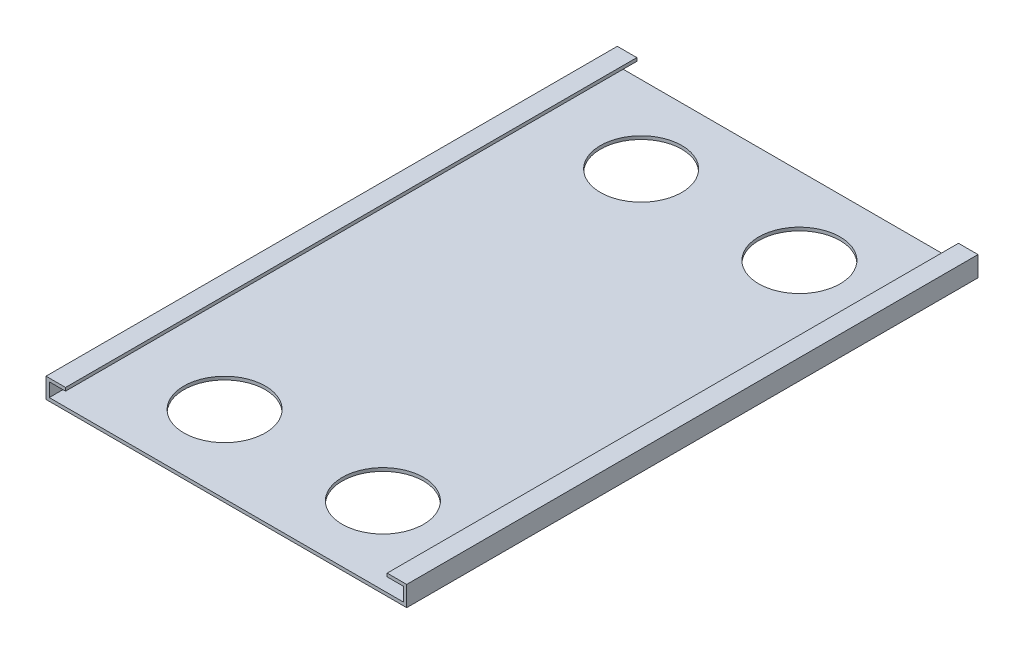
ISO-10303-21;
HEADER;
FILE_DESCRIPTION(('STEP AP214'),'2;1');
FILE_NAME('part.step','',(''),(''),'','','');
FILE_SCHEMA(('AUTOMOTIVE_DESIGN { 1 0 10303 214 1 1 1 1 }'));
ENDSEC;
DATA;
#1=APPLICATION_CONTEXT('core data for automotive mechanical design processes');
#2=APPLICATION_PROTOCOL_DEFINITION('international standard','automotive_design',2000,#1);
#3=PRODUCT_CONTEXT('',#1,'mechanical');
#4=PRODUCT('Part','Part','',(#3));
#5=PRODUCT_RELATED_PRODUCT_CATEGORY('part','',(#4));
#6=PRODUCT_DEFINITION_FORMATION('','',#4);
#7=PRODUCT_DEFINITION_CONTEXT('part definition',#1,'design');
#8=PRODUCT_DEFINITION('design','',#6,#7);
#9=PRODUCT_DEFINITION_SHAPE('','',#8);
#10=(LENGTH_UNIT() NAMED_UNIT(*) SI_UNIT(.MILLI.,.METRE.));
#11=(NAMED_UNIT(*) PLANE_ANGLE_UNIT() SI_UNIT($,.RADIAN.));
#12=(NAMED_UNIT(*) SI_UNIT($,.STERADIAN.) SOLID_ANGLE_UNIT());
#13=UNCERTAINTY_MEASURE_WITH_UNIT(LENGTH_MEASURE(1.E-05),#10,'distance_accuracy_value','');
#14=(GEOMETRIC_REPRESENTATION_CONTEXT(3) GLOBAL_UNCERTAINTY_ASSIGNED_CONTEXT((#13)) GLOBAL_UNIT_ASSIGNED_CONTEXT((#10,
#11,#12)) REPRESENTATION_CONTEXT('',''));
#15=CARTESIAN_POINT('',(0.,0.,0.));
#16=DIRECTION('',(0.,0.,1.));
#17=DIRECTION('',(1.,0.,0.));
#18=AXIS2_PLACEMENT_3D('',#15,#16,#17);
#19=CARTESIAN_POINT('',(-27.6352,2.13359999999999,89.154));
#20=DIRECTION('',(0.,1.,0.));
#21=DIRECTION('',(0.,0.,1.));
#22=AXIS2_PLACEMENT_3D('',#19,#20,#21);
#23=PLANE('',#22);
#24=DIRECTION('',(1.,0.,0.));
#25=VECTOR('',#24,1.);
#26=CARTESIAN_POINT('',(-27.6352,2.13359999999999,0.));
#27=LINE('',#26,#25);
#28=CARTESIAN_POINT('',(-27.6352,2.13359999999999,0.));
#29=VERTEX_POINT('',#28);
#30=CARTESIAN_POINT('',(-25.0952,2.13359999999999,0.));
#31=VERTEX_POINT('',#30);
#32=EDGE_CURVE('E155',#29,#31,#27,.T.);
#33=ORIENTED_EDGE('',*,*,#32,.T.);
#34=DIRECTION('',(0.,0.,-1.));
#35=VECTOR('',#34,1.);
#36=CARTESIAN_POINT('',(-25.0952,2.13359999999999,89.154));
#37=LINE('',#36,#35);
#38=CARTESIAN_POINT('',(-25.0952,2.13359999999999,89.154));
#39=VERTEX_POINT('',#38);
#40=EDGE_CURVE('E11',#39,#31,#37,.T.);
#41=ORIENTED_EDGE('',*,*,#40,.F.);
#42=DIRECTION('',(1.,0.,0.));
#43=VECTOR('',#42,1.);
#44=CARTESIAN_POINT('',(-27.6352,2.13359999999999,89.154));
#45=LINE('',#44,#43);
#46=CARTESIAN_POINT('',(-27.6352,2.13359999999999,89.154));
#47=VERTEX_POINT('',#46);
#48=EDGE_CURVE('E103',#47,#39,#45,.T.);
#49=ORIENTED_EDGE('',*,*,#48,.F.);
#50=DIRECTION('',(0.,0.,-1.));
#51=VECTOR('',#50,1.);
#52=CARTESIAN_POINT('',(-27.6352,2.13359999999999,89.154));
#53=LINE('',#52,#51);
#54=EDGE_CURVE('E151',#47,#29,#53,.T.);
#55=ORIENTED_EDGE('',*,*,#54,.T.);
#56=EDGE_LOOP('',(#33,#41,#49,#55));
#57=FACE_BOUND('',#56,.T.);
#58=ADVANCED_FACE('F33',(#57),#23,.F.);
#59=CARTESIAN_POINT('',(-25.0952,2.64159999999999,89.154));
#60=DIRECTION('',(1.,0.,0.));
#61=DIRECTION('',(0.,0.,-1.));
#62=AXIS2_PLACEMENT_3D('',#59,#60,#61);
#63=PLANE('',#62);
#64=DIRECTION('',(0.,-1.,0.));
#65=VECTOR('',#64,1.);
#66=CARTESIAN_POINT('',(-25.0952,2.64159999999999,0.));
#67=LINE('',#66,#65);
#68=CARTESIAN_POINT('',(-25.0952,2.64159999999999,0.));
#69=VERTEX_POINT('',#68);
#70=EDGE_CURVE('E158',#69,#31,#67,.T.);
#71=ORIENTED_EDGE('',*,*,#70,.F.);
#72=DIRECTION('',(0.,0.,-1.));
#73=VECTOR('',#72,1.);
#74=CARTESIAN_POINT('',(-25.0952,2.64159999999999,89.154));
#75=LINE('',#74,#73);
#76=CARTESIAN_POINT('',(-25.0952,2.64159999999999,89.154));
#77=VERTEX_POINT('',#76);
#78=EDGE_CURVE('E42',#77,#69,#75,.T.);
#79=ORIENTED_EDGE('',*,*,#78,.F.);
#80=DIRECTION('',(0.,-1.,0.));
#81=VECTOR('',#80,1.);
#82=CARTESIAN_POINT('',(-25.0952,2.64159999999999,89.154));
#83=LINE('',#82,#81);
#84=EDGE_CURVE('E224',#77,#39,#83,.T.);
#85=ORIENTED_EDGE('',*,*,#84,.T.);
#86=ORIENTED_EDGE('',*,*,#40,.T.);
#87=EDGE_LOOP('',(#71,#79,#85,#86));
#88=FACE_BOUND('',#87,.T.);
#89=ADVANCED_FACE('F269',(#88),#63,.T.);
#90=CARTESIAN_POINT('',(-27.6352,2.64159999999999,89.154));
#91=DIRECTION('',(0.,1.,0.));
#92=DIRECTION('',(0.,0.,1.));
#93=AXIS2_PLACEMENT_3D('',#90,#91,#92);
#94=PLANE('',#93);
#95=DIRECTION('',(1.,0.,0.));
#96=VECTOR('',#95,1.);
#97=CARTESIAN_POINT('',(-27.6352,2.64159999999999,0.));
#98=LINE('',#97,#96);
#99=CARTESIAN_POINT('',(-28.1432,2.64159999999999,0.));
#100=VERTEX_POINT('',#99);
#101=EDGE_CURVE('E162',#100,#69,#98,.T.);
#102=ORIENTED_EDGE('',*,*,#101,.F.);
#103=DIRECTION('',(0.,0.,-1.));
#104=VECTOR('',#103,1.);
#105=CARTESIAN_POINT('',(-28.1432,2.64159999999999,89.154));
#106=LINE('',#105,#104);
#107=CARTESIAN_POINT('',(-28.1432,2.64159999999999,89.154));
#108=VERTEX_POINT('',#107);
#109=EDGE_CURVE('E198',#108,#100,#106,.T.);
#110=ORIENTED_EDGE('',*,*,#109,.F.);
#111=DIRECTION('',(1.,0.,0.));
#112=VECTOR('',#111,1.);
#113=CARTESIAN_POINT('',(-27.6352,2.64159999999999,89.154));
#114=LINE('',#113,#112);
#115=EDGE_CURVE('E227',#108,#77,#114,.T.);
#116=ORIENTED_EDGE('',*,*,#115,.T.);
#117=ORIENTED_EDGE('',*,*,#78,.T.);
#118=EDGE_LOOP('',(#102,#110,#116,#117));
#119=FACE_BOUND('',#118,.T.);
#120=ADVANCED_FACE('F274',(#119),#94,.T.);
#121=CARTESIAN_POINT('',(-28.1432,0.,89.154));
#122=DIRECTION('',(-1.,0.,0.));
#123=DIRECTION('',(0.,0.,1.));
#124=AXIS2_PLACEMENT_3D('',#121,#122,#123);
#125=PLANE('',#124);
#126=DIRECTION('',(0.,1.,0.));
#127=VECTOR('',#126,1.);
#128=CARTESIAN_POINT('',(-28.1432,0.,0.));
#129=LINE('',#128,#127);
#130=CARTESIAN_POINT('',(-28.1432,-0.508,0.));
#131=VERTEX_POINT('',#130);
#132=EDGE_CURVE('E165',#131,#100,#129,.T.);
#133=ORIENTED_EDGE('',*,*,#132,.F.);
#134=DIRECTION('',(0.,0.,-1.));
#135=VECTOR('',#134,1.);
#136=CARTESIAN_POINT('',(-28.1432,-0.508,89.154));
#137=LINE('',#136,#135);
#138=CARTESIAN_POINT('',(-28.1432,-0.508,89.154));
#139=VERTEX_POINT('',#138);
#140=EDGE_CURVE('E196',#139,#131,#137,.T.);
#141=ORIENTED_EDGE('',*,*,#140,.F.);
#142=DIRECTION('',(0.,1.,0.));
#143=VECTOR('',#142,1.);
#144=CARTESIAN_POINT('',(-28.1432,0.,89.154));
#145=LINE('',#144,#143);
#146=EDGE_CURVE('E230',#139,#108,#145,.T.);
#147=ORIENTED_EDGE('',*,*,#146,.T.);
#148=ORIENTED_EDGE('',*,*,#109,.T.);
#149=EDGE_LOOP('',(#133,#141,#147,#148));
#150=FACE_BOUND('',#149,.T.);
#151=ADVANCED_FACE('F283',(#150),#125,.T.);
#152=CARTESIAN_POINT('',(27.6352,-0.508,89.154));
#153=DIRECTION('',(0.,-1.,0.));
#154=DIRECTION('',(0.,0.,-1.));
#155=AXIS2_PLACEMENT_3D('',#152,#153,#154);
#156=PLANE('',#155);
#157=CARTESIAN_POINT('',(12.35,-0.508,12.077));
#158=DIRECTION('',(0.,-1.,0.));
#159=DIRECTION('',(0.,0.,-1.));
#160=AXIS2_PLACEMENT_3D('',#157,#158,#159);
#161=CIRCLE('',#160,6.35);
#162=CARTESIAN_POINT('',(12.35,-0.508,5.727));
#163=VERTEX_POINT('',#162);
#164=EDGE_CURVE('E159',#163,#163,#161,.T.);
#165=ORIENTED_EDGE('',*,*,#164,.F.);
#166=EDGE_LOOP('',(#165));
#167=FACE_BOUND('',#166,.T.);
#168=CARTESIAN_POINT('',(-12.35,-0.508,12.077));
#169=DIRECTION('',(0.,-1.,0.));
#170=DIRECTION('',(0.,0.,-1.));
#171=AXIS2_PLACEMENT_3D('',#168,#169,#170);
#172=CIRCLE('',#171,6.35);
#173=CARTESIAN_POINT('',(-12.35,-0.508,5.727));
#174=VERTEX_POINT('',#173);
#175=EDGE_CURVE('E210',#174,#174,#172,.T.);
#176=ORIENTED_EDGE('',*,*,#175,.F.);
#177=EDGE_LOOP('',(#176));
#178=FACE_BOUND('',#177,.T.);
#179=CARTESIAN_POINT('',(-12.35,-0.508,77.077));
#180=DIRECTION('',(0.,-1.,0.));
#181=DIRECTION('',(0.,0.,-1.));
#182=AXIS2_PLACEMENT_3D('',#179,#180,#181);
#183=CIRCLE('',#182,6.35);
#184=CARTESIAN_POINT('',(-12.35,-0.508,70.727));
#185=VERTEX_POINT('',#184);
#186=EDGE_CURVE('E207',#185,#185,#183,.T.);
#187=ORIENTED_EDGE('',*,*,#186,.F.);
#188=EDGE_LOOP('',(#187));
#189=FACE_BOUND('',#188,.T.);
#190=CARTESIAN_POINT('',(12.35,-0.508,77.077));
#191=DIRECTION('',(0.,-1.,0.));
#192=DIRECTION('',(0.,0.,-1.));
#193=AXIS2_PLACEMENT_3D('',#190,#191,#192);
#194=CIRCLE('',#193,6.35);
#195=CARTESIAN_POINT('',(12.35,-0.508,70.727));
#196=VERTEX_POINT('',#195);
#197=EDGE_CURVE('E204',#196,#196,#194,.T.);
#198=ORIENTED_EDGE('',*,*,#197,.F.);
#199=EDGE_LOOP('',(#198));
#200=FACE_BOUND('',#199,.T.);
#201=DIRECTION('',(1.,0.,0.));
#202=VECTOR('',#201,1.);
#203=CARTESIAN_POINT('',(27.6352,-0.508,0.));
#204=LINE('',#203,#202);
#205=CARTESIAN_POINT('',(28.1432,-0.508,0.));
#206=VERTEX_POINT('',#205);
#207=EDGE_CURVE('E168',#206,#131,#204,.F.);
#208=ORIENTED_EDGE('',*,*,#207,.F.);
#209=DIRECTION('',(0.,0.,-1.));
#210=VECTOR('',#209,1.);
#211=CARTESIAN_POINT('',(28.1432,-0.508,89.154));
#212=LINE('',#211,#210);
#213=CARTESIAN_POINT('',(28.1432,-0.508,89.154));
#214=VERTEX_POINT('',#213);
#215=EDGE_CURVE('E194',#214,#206,#212,.T.);
#216=ORIENTED_EDGE('',*,*,#215,.F.);
#217=DIRECTION('',(1.,0.,0.));
#218=VECTOR('',#217,1.);
#219=CARTESIAN_POINT('',(27.6352,-0.508,89.154));
#220=LINE('',#219,#218);
#221=EDGE_CURVE('E233',#214,#139,#220,.F.);
#222=ORIENTED_EDGE('',*,*,#221,.T.);
#223=ORIENTED_EDGE('',*,*,#140,.T.);
#224=EDGE_LOOP('',(#208,#216,#222,#223));
#225=FACE_BOUND('',#224,.T.);
#226=ADVANCED_FACE('F286',(#167,#178,#189,#200,#225),#156,.T.);
#227=CARTESIAN_POINT('',(28.1432,0.,89.154));
#228=DIRECTION('',(1.,0.,0.));
#229=DIRECTION('',(0.,0.,-1.));
#230=AXIS2_PLACEMENT_3D('',#227,#228,#229);
#231=PLANE('',#230);
#232=DIRECTION('',(0.,1.,0.));
#233=VECTOR('',#232,1.);
#234=CARTESIAN_POINT('',(28.1432,0.,0.));
#235=LINE('',#234,#233);
#236=CARTESIAN_POINT('',(28.1432,2.64159999999999,0.));
#237=VERTEX_POINT('',#236);
#238=EDGE_CURVE('E171',#237,#206,#235,.F.);
#239=ORIENTED_EDGE('',*,*,#238,.F.);
#240=DIRECTION('',(0.,0.,-1.));
#241=VECTOR('',#240,1.);
#242=CARTESIAN_POINT('',(28.1432,2.64159999999999,89.154));
#243=LINE('',#242,#241);
#244=CARTESIAN_POINT('',(28.1432,2.64159999999999,89.154));
#245=VERTEX_POINT('',#244);
#246=EDGE_CURVE('E192',#245,#237,#243,.T.);
#247=ORIENTED_EDGE('',*,*,#246,.F.);
#248=DIRECTION('',(0.,1.,0.));
#249=VECTOR('',#248,1.);
#250=CARTESIAN_POINT('',(28.1432,0.,89.154));
#251=LINE('',#250,#249);
#252=EDGE_CURVE('E236',#245,#214,#251,.F.);
#253=ORIENTED_EDGE('',*,*,#252,.T.);
#254=ORIENTED_EDGE('',*,*,#215,.T.);
#255=EDGE_LOOP('',(#239,#247,#253,#254));
#256=FACE_BOUND('',#255,.T.);
#257=ADVANCED_FACE('F288',(#256),#231,.T.);
#258=CARTESIAN_POINT('',(27.6352,2.64159999999999,89.154));
#259=DIRECTION('',(0.,1.,0.));
#260=DIRECTION('',(0.,0.,1.));
#261=AXIS2_PLACEMENT_3D('',#258,#259,#260);
#262=PLANE('',#261);
#263=DIRECTION('',(1.,0.,0.));
#264=VECTOR('',#263,1.);
#265=CARTESIAN_POINT('',(27.6352,2.64159999999999,0.));
#266=LINE('',#265,#264);
#267=CARTESIAN_POINT('',(25.0952,2.64159999999999,0.));
#268=VERTEX_POINT('',#267);
#269=EDGE_CURVE('E174',#268,#237,#266,.T.);
#270=ORIENTED_EDGE('',*,*,#269,.F.);
#271=DIRECTION('',(0.,0.,-1.));
#272=VECTOR('',#271,1.);
#273=CARTESIAN_POINT('',(25.0952,2.64159999999999,89.154));
#274=LINE('',#273,#272);
#275=CARTESIAN_POINT('',(25.0952,2.64159999999999,89.154));
#276=VERTEX_POINT('',#275);
#277=EDGE_CURVE('E190',#276,#268,#274,.T.);
#278=ORIENTED_EDGE('',*,*,#277,.F.);
#279=DIRECTION('',(1.,0.,0.));
#280=VECTOR('',#279,1.);
#281=CARTESIAN_POINT('',(27.6352,2.64159999999999,89.154));
#282=LINE('',#281,#280);
#283=EDGE_CURVE('E239',#276,#245,#282,.T.);
#284=ORIENTED_EDGE('',*,*,#283,.T.);
#285=ORIENTED_EDGE('',*,*,#246,.T.);
#286=EDGE_LOOP('',(#270,#278,#284,#285));
#287=FACE_BOUND('',#286,.T.);
#288=ADVANCED_FACE('F252',(#287),#262,.T.);
#289=CARTESIAN_POINT('',(25.0952,2.13359999999999,89.154));
#290=DIRECTION('',(-1.,0.,0.));
#291=DIRECTION('',(0.,0.,1.));
#292=AXIS2_PLACEMENT_3D('',#289,#290,#291);
#293=PLANE('',#292);
#294=DIRECTION('',(0.,1.,0.));
#295=VECTOR('',#294,1.);
#296=CARTESIAN_POINT('',(25.0952,2.13359999999999,0.));
#297=LINE('',#296,#295);
#298=CARTESIAN_POINT('',(25.0952,2.13359999999999,0.));
#299=VERTEX_POINT('',#298);
#300=EDGE_CURVE('E177',#299,#268,#297,.T.);
#301=ORIENTED_EDGE('',*,*,#300,.F.);
#302=DIRECTION('',(0.,0.,-1.));
#303=VECTOR('',#302,1.);
#304=CARTESIAN_POINT('',(25.0952,2.13359999999999,89.154));
#305=LINE('',#304,#303);
#306=CARTESIAN_POINT('',(25.0952,2.13359999999999,89.154));
#307=VERTEX_POINT('',#306);
#308=EDGE_CURVE('E188',#307,#299,#305,.T.);
#309=ORIENTED_EDGE('',*,*,#308,.F.);
#310=DIRECTION('',(0.,1.,0.));
#311=VECTOR('',#310,1.);
#312=CARTESIAN_POINT('',(25.0952,2.13359999999999,89.154));
#313=LINE('',#312,#311);
#314=EDGE_CURVE('E242',#307,#276,#313,.T.);
#315=ORIENTED_EDGE('',*,*,#314,.T.);
#316=ORIENTED_EDGE('',*,*,#277,.T.);
#317=EDGE_LOOP('',(#301,#309,#315,#316));
#318=FACE_BOUND('',#317,.T.);
#319=ADVANCED_FACE('F246',(#318),#293,.T.);
#320=CARTESIAN_POINT('',(27.6352,2.13359999999999,89.154));
#321=DIRECTION('',(0.,1.,0.));
#322=DIRECTION('',(0.,0.,1.));
#323=AXIS2_PLACEMENT_3D('',#320,#321,#322);
#324=PLANE('',#323);
#325=DIRECTION('',(1.,0.,0.));
#326=VECTOR('',#325,1.);
#327=CARTESIAN_POINT('',(27.6352,2.13359999999999,0.));
#328=LINE('',#327,#326);
#329=CARTESIAN_POINT('',(27.6352,2.13359999999999,0.));
#330=VERTEX_POINT('',#329);
#331=EDGE_CURVE('E180',#299,#330,#328,.T.);
#332=ORIENTED_EDGE('',*,*,#331,.T.);
#333=DIRECTION('',(0.,0.,-1.));
#334=VECTOR('',#333,1.);
#335=CARTESIAN_POINT('',(27.6352,2.13359999999999,89.154));
#336=LINE('',#335,#334);
#337=CARTESIAN_POINT('',(27.6352,2.13359999999999,89.154));
#338=VERTEX_POINT('',#337);
#339=EDGE_CURVE('E146',#338,#330,#336,.T.);
#340=ORIENTED_EDGE('',*,*,#339,.F.);
#341=DIRECTION('',(1.,0.,0.));
#342=VECTOR('',#341,1.);
#343=CARTESIAN_POINT('',(27.6352,2.13359999999999,89.154));
#344=LINE('',#343,#342);
#345=EDGE_CURVE('E137',#307,#338,#344,.T.);
#346=ORIENTED_EDGE('',*,*,#345,.F.);
#347=ORIENTED_EDGE('',*,*,#308,.T.);
#348=EDGE_LOOP('',(#332,#340,#346,#347));
#349=FACE_BOUND('',#348,.T.);
#350=ADVANCED_FACE('F259',(#349),#324,.F.);
#351=CARTESIAN_POINT('',(27.6352,0.,89.154));
#352=DIRECTION('',(1.,0.,0.));
#353=DIRECTION('',(0.,0.,-1.));
#354=AXIS2_PLACEMENT_3D('',#351,#352,#353);
#355=PLANE('',#354);
#356=DIRECTION('',(0.,-1.,0.));
#357=VECTOR('',#356,1.);
#358=CARTESIAN_POINT('',(27.6352,0.,0.));
#359=LINE('',#358,#357);
#360=CARTESIAN_POINT('',(27.6352,0.,0.));
#361=VERTEX_POINT('',#360);
#362=EDGE_CURVE('E145',#330,#361,#359,.T.);
#363=ORIENTED_EDGE('',*,*,#362,.T.);
#364=DIRECTION('',(0.,0.,-1.));
#365=VECTOR('',#364,1.);
#366=CARTESIAN_POINT('',(27.6352,0.,89.154));
#367=LINE('',#366,#365);
#368=CARTESIAN_POINT('',(27.6352,0.,89.154));
#369=VERTEX_POINT('',#368);
#370=EDGE_CURVE('E142',#369,#361,#367,.T.);
#371=ORIENTED_EDGE('',*,*,#370,.F.);
#372=DIRECTION('',(0.,-1.,0.));
#373=VECTOR('',#372,1.);
#374=CARTESIAN_POINT('',(27.6352,0.,89.154));
#375=LINE('',#374,#373);
#376=EDGE_CURVE('E130',#338,#369,#375,.T.);
#377=ORIENTED_EDGE('',*,*,#376,.F.);
#378=ORIENTED_EDGE('',*,*,#339,.T.);
#379=EDGE_LOOP('',(#363,#371,#377,#378));
#380=FACE_BOUND('',#379,.T.);
#381=ADVANCED_FACE('F143',(#380),#355,.F.);
#382=CARTESIAN_POINT('',(27.6352,0.,89.154));
#383=DIRECTION('',(0.,-1.,0.));
#384=DIRECTION('',(0.,0.,-1.));
#385=AXIS2_PLACEMENT_3D('',#382,#383,#384);
#386=PLANE('',#385);
#387=CARTESIAN_POINT('',(12.35,0.,12.077));
#388=DIRECTION('',(0.,-1.,0.));
#389=DIRECTION('',(0.,0.,-1.));
#390=AXIS2_PLACEMENT_3D('',#387,#388,#389);
#391=CIRCLE('',#390,6.35);
#392=CARTESIAN_POINT('',(12.35,0.,5.727));
#393=VERTEX_POINT('',#392);
#394=EDGE_CURVE('E36',#393,#393,#391,.T.);
#395=ORIENTED_EDGE('',*,*,#394,.T.);
#396=EDGE_LOOP('',(#395));
#397=FACE_BOUND('',#396,.T.);
#398=CARTESIAN_POINT('',(-12.35,0.,12.077));
#399=DIRECTION('',(0.,-1.,0.));
#400=DIRECTION('',(0.,0.,-1.));
#401=AXIS2_PLACEMENT_3D('',#398,#399,#400);
#402=CIRCLE('',#401,6.35);
#403=CARTESIAN_POINT('',(-12.35,0.,5.727));
#404=VERTEX_POINT('',#403);
#405=EDGE_CURVE('E208',#404,#404,#402,.T.);
#406=ORIENTED_EDGE('',*,*,#405,.T.);
#407=EDGE_LOOP('',(#406));
#408=FACE_BOUND('',#407,.T.);
#409=CARTESIAN_POINT('',(-12.35,0.,77.077));
#410=DIRECTION('',(0.,-1.,0.));
#411=DIRECTION('',(0.,0.,-1.));
#412=AXIS2_PLACEMENT_3D('',#409,#410,#411);
#413=CIRCLE('',#412,6.35);
#414=CARTESIAN_POINT('',(-12.35,0.,70.727));
#415=VERTEX_POINT('',#414);
#416=EDGE_CURVE('E205',#415,#415,#413,.T.);
#417=ORIENTED_EDGE('',*,*,#416,.T.);
#418=EDGE_LOOP('',(#417));
#419=FACE_BOUND('',#418,.T.);
#420=CARTESIAN_POINT('',(12.35,0.,77.077));
#421=DIRECTION('',(0.,-1.,0.));
#422=DIRECTION('',(0.,0.,-1.));
#423=AXIS2_PLACEMENT_3D('',#420,#421,#422);
#424=CIRCLE('',#423,6.35);
#425=CARTESIAN_POINT('',(12.35,0.,70.727));
#426=VERTEX_POINT('',#425);
#427=EDGE_CURVE('E201',#426,#426,#424,.T.);
#428=ORIENTED_EDGE('',*,*,#427,.T.);
#429=EDGE_LOOP('',(#428));
#430=FACE_BOUND('',#429,.T.);
#431=DIRECTION('',(-1.,0.,0.));
#432=VECTOR('',#431,1.);
#433=CARTESIAN_POINT('',(27.6352,0.,0.));
#434=LINE('',#433,#432);
#435=CARTESIAN_POINT('',(-27.6352,0.,0.));
#436=VERTEX_POINT('',#435);
#437=EDGE_CURVE('E91',#361,#436,#434,.T.);
#438=ORIENTED_EDGE('',*,*,#437,.T.);
#439=DIRECTION('',(0.,0.,-1.));
#440=VECTOR('',#439,1.);
#441=CARTESIAN_POINT('',(-27.6352,0.,89.154));
#442=LINE('',#441,#440);
#443=CARTESIAN_POINT('',(-27.6352,0.,89.154));
#444=VERTEX_POINT('',#443);
#445=EDGE_CURVE('E147',#444,#436,#442,.T.);
#446=ORIENTED_EDGE('',*,*,#445,.F.);
#447=DIRECTION('',(-1.,0.,0.));
#448=VECTOR('',#447,1.);
#449=CARTESIAN_POINT('',(27.6352,0.,89.154));
#450=LINE('',#449,#448);
#451=EDGE_CURVE('E134',#369,#444,#450,.T.);
#452=ORIENTED_EDGE('',*,*,#451,.F.);
#453=ORIENTED_EDGE('',*,*,#370,.T.);
#454=EDGE_LOOP('',(#438,#446,#452,#453));
#455=FACE_BOUND('',#454,.T.);
#456=ADVANCED_FACE('F149',(#397,#408,#419,#430,#455),#386,.F.);
#457=CARTESIAN_POINT('',(-27.6352,0.,89.154));
#458=DIRECTION('',(-1.,0.,0.));
#459=DIRECTION('',(0.,0.,1.));
#460=AXIS2_PLACEMENT_3D('',#457,#458,#459);
#461=PLANE('',#460);
#462=DIRECTION('',(0.,1.,0.));
#463=VECTOR('',#462,1.);
#464=CARTESIAN_POINT('',(-27.6352,0.,0.));
#465=LINE('',#464,#463);
#466=EDGE_CURVE('E97',#436,#29,#465,.T.);
#467=ORIENTED_EDGE('',*,*,#466,.T.);
#468=ORIENTED_EDGE('',*,*,#54,.F.);
#469=DIRECTION('',(0.,1.,0.));
#470=VECTOR('',#469,1.);
#471=CARTESIAN_POINT('',(-27.6352,0.,89.154));
#472=LINE('',#471,#470);
#473=EDGE_CURVE('E51',#444,#47,#472,.T.);
#474=ORIENTED_EDGE('',*,*,#473,.F.);
#475=ORIENTED_EDGE('',*,*,#445,.T.);
#476=EDGE_LOOP('',(#467,#468,#474,#475));
#477=FACE_BOUND('',#476,.T.);
#478=ADVANCED_FACE('F329',(#477),#461,.F.);
#479=CARTESIAN_POINT('',(0.,0.,89.154));
#480=DIRECTION('',(0.,0.,-1.));
#481=DIRECTION('',(-1.,0.,0.));
#482=AXIS2_PLACEMENT_3D('',#479,#480,#481);
#483=PLANE('',#482);
#484=ORIENTED_EDGE('',*,*,#48,.T.);
#485=ORIENTED_EDGE('',*,*,#84,.F.);
#486=ORIENTED_EDGE('',*,*,#115,.F.);
#487=ORIENTED_EDGE('',*,*,#146,.F.);
#488=ORIENTED_EDGE('',*,*,#221,.F.);
#489=ORIENTED_EDGE('',*,*,#252,.F.);
#490=ORIENTED_EDGE('',*,*,#283,.F.);
#491=ORIENTED_EDGE('',*,*,#314,.F.);
#492=ORIENTED_EDGE('',*,*,#345,.T.);
#493=ORIENTED_EDGE('',*,*,#376,.T.);
#494=ORIENTED_EDGE('',*,*,#451,.T.);
#495=ORIENTED_EDGE('',*,*,#473,.T.);
#496=EDGE_LOOP('',(#484,#485,#486,#487,#488,#489,#490,#491,#492,#493,#494,#495));
#497=FACE_BOUND('',#496,.T.);
#498=ADVANCED_FACE('F132',(#497),#483,.F.);
#499=CARTESIAN_POINT('',(0.,0.,0.));
#500=DIRECTION('',(0.,0.,-1.));
#501=DIRECTION('',(-1.,0.,0.));
#502=AXIS2_PLACEMENT_3D('',#499,#500,#501);
#503=PLANE('',#502);
#504=ORIENTED_EDGE('',*,*,#32,.F.);
#505=ORIENTED_EDGE('',*,*,#466,.F.);
#506=ORIENTED_EDGE('',*,*,#437,.F.);
#507=ORIENTED_EDGE('',*,*,#362,.F.);
#508=ORIENTED_EDGE('',*,*,#331,.F.);
#509=ORIENTED_EDGE('',*,*,#300,.T.);
#510=ORIENTED_EDGE('',*,*,#269,.T.);
#511=ORIENTED_EDGE('',*,*,#238,.T.);
#512=ORIENTED_EDGE('',*,*,#207,.T.);
#513=ORIENTED_EDGE('',*,*,#132,.T.);
#514=ORIENTED_EDGE('',*,*,#101,.T.);
#515=ORIENTED_EDGE('',*,*,#70,.T.);
#516=EDGE_LOOP('',(#504,#505,#506,#507,#508,#509,#510,#511,#512,#513,#514,#515));
#517=FACE_BOUND('',#516,.T.);
#518=ADVANCED_FACE('F257',(#517),#503,.T.);
#519=CARTESIAN_POINT('',(12.35,2.64159999999999,77.077));
#520=DIRECTION('',(0.,-1.,0.));
#521=DIRECTION('',(0.,0.,-1.));
#522=AXIS2_PLACEMENT_3D('',#519,#520,#521);
#523=CYLINDRICAL_SURFACE('',#522,6.35);
#524=ORIENTED_EDGE('',*,*,#197,.T.);
#525=EDGE_LOOP('',(#524));
#526=FACE_BOUND('',#525,.T.);
#527=ORIENTED_EDGE('',*,*,#427,.F.);
#528=EDGE_LOOP('',(#527));
#529=FACE_BOUND('',#528,.T.);
#530=ADVANCED_FACE('F338',(#526,#529),#523,.F.);
#531=CARTESIAN_POINT('',(-12.35,2.64159999999999,77.077));
#532=DIRECTION('',(0.,-1.,0.));
#533=DIRECTION('',(0.,0.,-1.));
#534=AXIS2_PLACEMENT_3D('',#531,#532,#533);
#535=CYLINDRICAL_SURFACE('',#534,6.35);
#536=ORIENTED_EDGE('',*,*,#186,.T.);
#537=EDGE_LOOP('',(#536));
#538=FACE_BOUND('',#537,.T.);
#539=ORIENTED_EDGE('',*,*,#416,.F.);
#540=EDGE_LOOP('',(#539));
#541=FACE_BOUND('',#540,.T.);
#542=ADVANCED_FACE('F343',(#538,#541),#535,.F.);
#543=CARTESIAN_POINT('',(-12.35,2.64159999999999,12.077));
#544=DIRECTION('',(0.,-1.,0.));
#545=DIRECTION('',(0.,0.,-1.));
#546=AXIS2_PLACEMENT_3D('',#543,#544,#545);
#547=CYLINDRICAL_SURFACE('',#546,6.35);
#548=ORIENTED_EDGE('',*,*,#175,.T.);
#549=EDGE_LOOP('',(#548));
#550=FACE_BOUND('',#549,.T.);
#551=ORIENTED_EDGE('',*,*,#405,.F.);
#552=EDGE_LOOP('',(#551));
#553=FACE_BOUND('',#552,.T.);
#554=ADVANCED_FACE('F353',(#550,#553),#547,.F.);
#555=CARTESIAN_POINT('',(12.35,2.64159999999999,12.077));
#556=DIRECTION('',(0.,-1.,0.));
#557=DIRECTION('',(0.,0.,-1.));
#558=AXIS2_PLACEMENT_3D('',#555,#556,#557);
#559=CYLINDRICAL_SURFACE('',#558,6.35);
#560=ORIENTED_EDGE('',*,*,#164,.T.);
#561=EDGE_LOOP('',(#560));
#562=FACE_BOUND('',#561,.T.);
#563=ORIENTED_EDGE('',*,*,#394,.F.);
#564=EDGE_LOOP('',(#563));
#565=FACE_BOUND('',#564,.T.);
#566=ADVANCED_FACE('F362',(#562,#565),#559,.F.);
#567=CLOSED_SHELL('',(#58,#89,#120,#151,#226,#257,#288,#319,#350,#381,#456,#478,#498,#518,#530,
#542,#554,#566));
#568=MANIFOLD_SOLID_BREP('B2',#567);
#569=ADVANCED_BREP_SHAPE_REPRESENTATION('',(#18,#568),#14);
#570=SHAPE_DEFINITION_REPRESENTATION(#9,#569);
ENDSEC;
END-ISO-10303-21;
